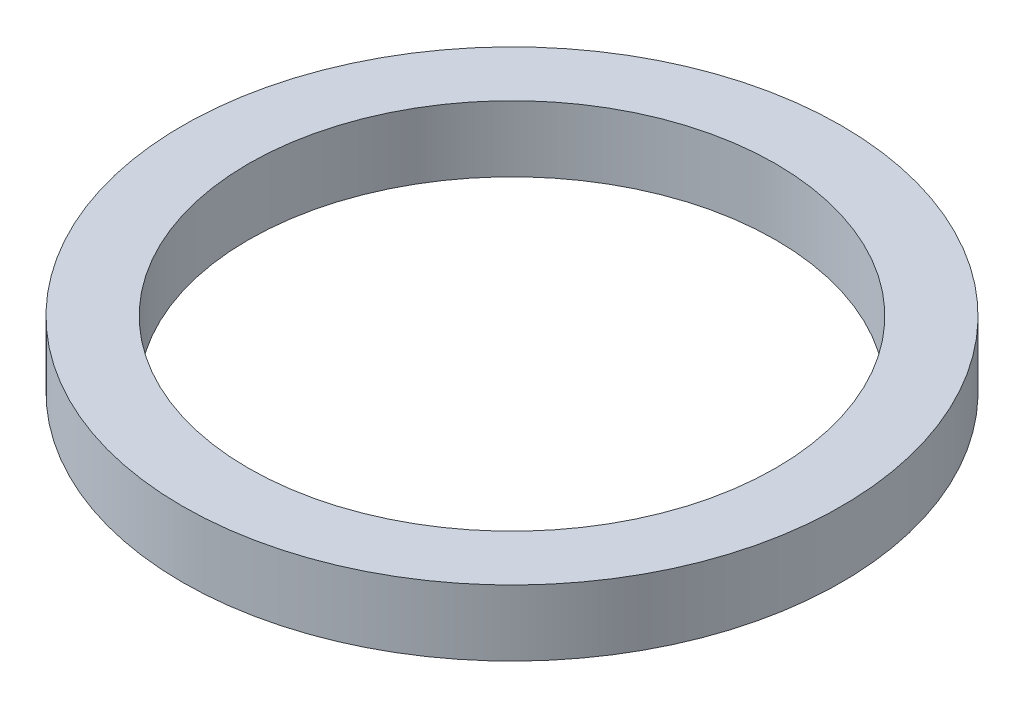
ISO-10303-21;
HEADER;
FILE_DESCRIPTION(('STEP AP214'),'2;1');
FILE_NAME('part.step','',(''),(''),'','','');
FILE_SCHEMA(('AUTOMOTIVE_DESIGN { 1 0 10303 214 1 1 1 1 }'));
ENDSEC;
DATA;
#1=APPLICATION_CONTEXT('core data for automotive mechanical design processes');
#2=APPLICATION_PROTOCOL_DEFINITION('international standard','automotive_design',2000,#1);
#3=PRODUCT_CONTEXT('',#1,'mechanical');
#4=PRODUCT('Part','Part','',(#3));
#5=PRODUCT_RELATED_PRODUCT_CATEGORY('part','',(#4));
#6=PRODUCT_DEFINITION_FORMATION('','',#4);
#7=PRODUCT_DEFINITION_CONTEXT('part definition',#1,'design');
#8=PRODUCT_DEFINITION('design','',#6,#7);
#9=PRODUCT_DEFINITION_SHAPE('','',#8);
#10=(LENGTH_UNIT() NAMED_UNIT(*) SI_UNIT(.MILLI.,.METRE.));
#11=(NAMED_UNIT(*) PLANE_ANGLE_UNIT() SI_UNIT($,.RADIAN.));
#12=(NAMED_UNIT(*) SI_UNIT($,.STERADIAN.) SOLID_ANGLE_UNIT());
#13=UNCERTAINTY_MEASURE_WITH_UNIT(LENGTH_MEASURE(1.E-05),#10,'distance_accuracy_value','');
#14=(GEOMETRIC_REPRESENTATION_CONTEXT(3) GLOBAL_UNCERTAINTY_ASSIGNED_CONTEXT((#13)) GLOBAL_UNIT_ASSIGNED_CONTEXT((#10,
#11,#12)) REPRESENTATION_CONTEXT('',''));
#15=CARTESIAN_POINT('',(0.,0.,0.));
#16=DIRECTION('',(0.,0.,1.));
#17=DIRECTION('',(1.,0.,0.));
#18=AXIS2_PLACEMENT_3D('',#15,#16,#17);
#19=CARTESIAN_POINT('',(10.,-3.28490241138792,0.));
#20=DIRECTION('',(0.,-1.,0.));
#21=DIRECTION('',(0.,0.,-1.));
#22=AXIS2_PLACEMENT_3D('',#19,#20,#21);
#23=CYLINDRICAL_SURFACE('',#22,10.);
#24=CARTESIAN_POINT('',(10.,-2.,0.));
#25=DIRECTION('',(0.,-1.,0.));
#26=DIRECTION('',(0.,0.,-1.));
#27=AXIS2_PLACEMENT_3D('',#24,#25,#26);
#28=CIRCLE('',#27,10.);
#29=CARTESIAN_POINT('',(10.,-2.,-10.));
#30=VERTEX_POINT('',#29);
#31=EDGE_CURVE('E10',#30,#30,#28,.T.);
#32=ORIENTED_EDGE('',*,*,#31,.F.);
#33=EDGE_LOOP('',(#32));
#34=FACE_BOUND('',#33,.T.);
#35=CARTESIAN_POINT('',(10.,0.,0.));
#36=DIRECTION('',(0.,-1.,0.));
#37=DIRECTION('',(0.,0.,-1.));
#38=AXIS2_PLACEMENT_3D('',#35,#36,#37);
#39=CIRCLE('',#38,10.);
#40=CARTESIAN_POINT('',(10.,0.,-10.));
#41=VERTEX_POINT('',#40);
#42=EDGE_CURVE('E60',#41,#41,#39,.T.);
#43=ORIENTED_EDGE('',*,*,#42,.T.);
#44=EDGE_LOOP('',(#43));
#45=FACE_BOUND('',#44,.T.);
#46=ADVANCED_FACE('F43',(#34,#45),#23,.T.);
#47=CARTESIAN_POINT('',(0.,-2.,0.));
#48=DIRECTION('',(0.,1.,0.));
#49=DIRECTION('',(0.,0.,1.));
#50=AXIS2_PLACEMENT_3D('',#47,#48,#49);
#51=PLANE('',#50);
#52=CARTESIAN_POINT('',(10.,-2.,0.));
#53=DIRECTION('',(0.,-1.,0.));
#54=DIRECTION('',(0.,0.,-1.));
#55=AXIS2_PLACEMENT_3D('',#52,#53,#54);
#56=CIRCLE('',#55,8.);
#57=CARTESIAN_POINT('',(10.,-2.,-8.));
#58=VERTEX_POINT('',#57);
#59=EDGE_CURVE('E50',#58,#58,#56,.T.);
#60=ORIENTED_EDGE('',*,*,#59,.F.);
#61=EDGE_LOOP('',(#60));
#62=FACE_BOUND('',#61,.T.);
#63=ORIENTED_EDGE('',*,*,#31,.T.);
#64=EDGE_LOOP('',(#63));
#65=FACE_BOUND('',#64,.T.);
#66=ADVANCED_FACE('F76',(#62,#65),#51,.F.);
#67=CARTESIAN_POINT('',(10.,-3.28490241138792,0.));
#68=DIRECTION('',(0.,-1.,0.));
#69=DIRECTION('',(0.,0.,-1.));
#70=AXIS2_PLACEMENT_3D('',#67,#68,#69);
#71=CYLINDRICAL_SURFACE('',#70,8.);
#72=CARTESIAN_POINT('',(10.,0.,0.));
#73=DIRECTION('',(0.,-1.,0.));
#74=DIRECTION('',(0.,0.,-1.));
#75=AXIS2_PLACEMENT_3D('',#72,#73,#74);
#76=CIRCLE('',#75,8.);
#77=CARTESIAN_POINT('',(10.,0.,-8.));
#78=VERTEX_POINT('',#77);
#79=EDGE_CURVE('E55',#78,#78,#76,.T.);
#80=ORIENTED_EDGE('',*,*,#79,.F.);
#81=EDGE_LOOP('',(#80));
#82=FACE_BOUND('',#81,.T.);
#83=ORIENTED_EDGE('',*,*,#59,.T.);
#84=EDGE_LOOP('',(#83));
#85=FACE_BOUND('',#84,.T.);
#86=ADVANCED_FACE('F71',(#82,#85),#71,.F.);
#87=CARTESIAN_POINT('',(0.,0.,0.));
#88=DIRECTION('',(0.,-1.,0.));
#89=DIRECTION('',(0.,0.,-1.));
#90=AXIS2_PLACEMENT_3D('',#87,#88,#89);
#91=PLANE('',#90);
#92=ORIENTED_EDGE('',*,*,#42,.F.);
#93=EDGE_LOOP('',(#92));
#94=FACE_BOUND('',#93,.T.);
#95=ORIENTED_EDGE('',*,*,#79,.T.);
#96=EDGE_LOOP('',(#95));
#97=FACE_BOUND('',#96,.T.);
#98=ADVANCED_FACE('F68',(#94,#97),#91,.F.);
#99=CLOSED_SHELL('',(#46,#66,#86,#98));
#100=MANIFOLD_SOLID_BREP('B2',#99);
#101=ADVANCED_BREP_SHAPE_REPRESENTATION('',(#18,#100),#14);
#102=SHAPE_DEFINITION_REPRESENTATION(#9,#101);
ENDSEC;
END-ISO-10303-21;
